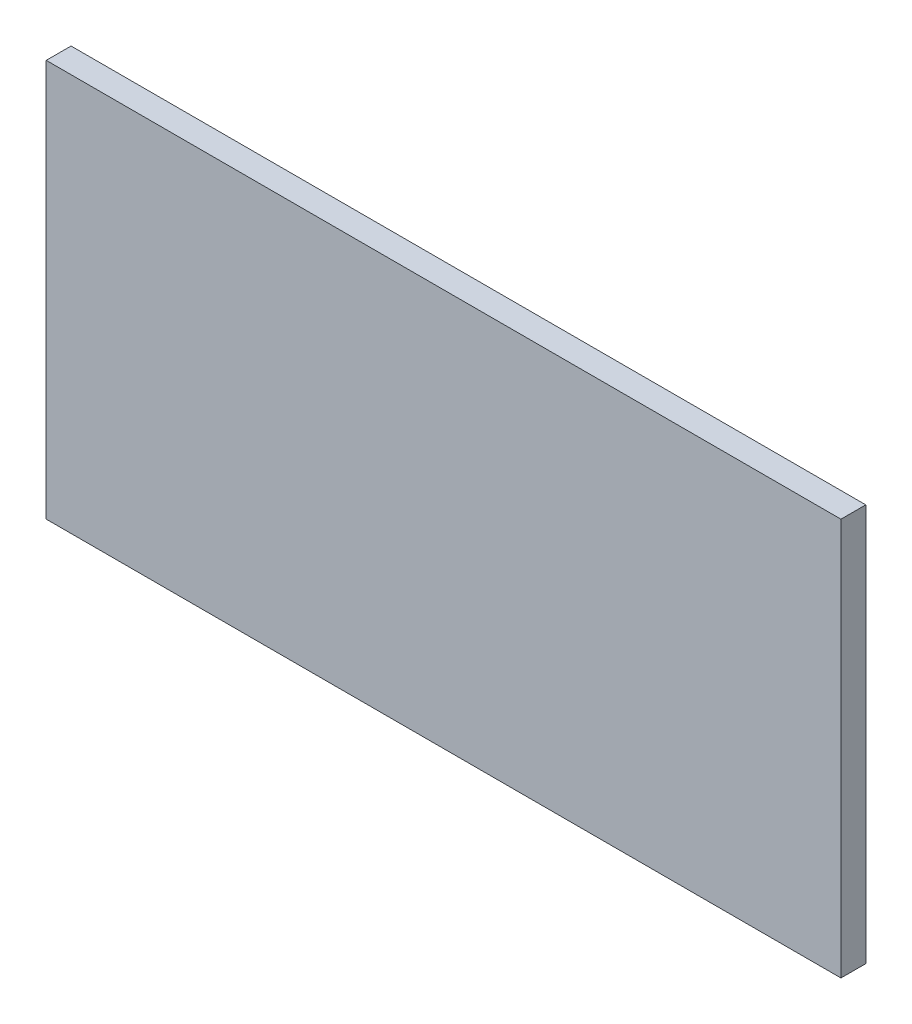
ISO-10303-21;
HEADER;
FILE_DESCRIPTION(('STEP AP214'),'2;1');
FILE_NAME('part.step','',(''),(''),'','','');
FILE_SCHEMA(('AUTOMOTIVE_DESIGN { 1 0 10303 214 1 1 1 1 }'));
ENDSEC;
DATA;
#1=APPLICATION_CONTEXT('core data for automotive mechanical design processes');
#2=APPLICATION_PROTOCOL_DEFINITION('international standard','automotive_design',2000,#1);
#3=PRODUCT_CONTEXT('',#1,'mechanical');
#4=PRODUCT('Part','Part','',(#3));
#5=PRODUCT_RELATED_PRODUCT_CATEGORY('part','',(#4));
#6=PRODUCT_DEFINITION_FORMATION('','',#4);
#7=PRODUCT_DEFINITION_CONTEXT('part definition',#1,'design');
#8=PRODUCT_DEFINITION('design','',#6,#7);
#9=PRODUCT_DEFINITION_SHAPE('','',#8);
#10=(LENGTH_UNIT() NAMED_UNIT(*) SI_UNIT(.MILLI.,.METRE.));
#11=(NAMED_UNIT(*) PLANE_ANGLE_UNIT() SI_UNIT($,.RADIAN.));
#12=(NAMED_UNIT(*) SI_UNIT($,.STERADIAN.) SOLID_ANGLE_UNIT());
#13=UNCERTAINTY_MEASURE_WITH_UNIT(LENGTH_MEASURE(1.E-05),#10,'distance_accuracy_value','');
#14=(GEOMETRIC_REPRESENTATION_CONTEXT(3) GLOBAL_UNCERTAINTY_ASSIGNED_CONTEXT((#13)) GLOBAL_UNIT_ASSIGNED_CONTEXT((#10,
#11,#12)) REPRESENTATION_CONTEXT('',''));
#15=CARTESIAN_POINT('',(0.,0.,0.));
#16=DIRECTION('',(0.,0.,1.));
#17=DIRECTION('',(1.,0.,0.));
#18=AXIS2_PLACEMENT_3D('',#15,#16,#17);
#19=CARTESIAN_POINT('',(40.,20.,2.5));
#20=DIRECTION('',(-1.,0.,0.));
#21=DIRECTION('',(0.,-1.,0.));
#22=AXIS2_PLACEMENT_3D('',#19,#20,#21);
#23=PLANE('',#22);
#24=DIRECTION('',(0.,1.,0.));
#25=VECTOR('',#24,1.);
#26=CARTESIAN_POINT('',(40.,20.,0.));
#27=LINE('',#26,#25);
#28=CARTESIAN_POINT('',(40.,-20.,0.));
#29=VERTEX_POINT('',#28);
#30=CARTESIAN_POINT('',(40.,20.,0.));
#31=VERTEX_POINT('',#30);
#32=EDGE_CURVE('E107',#29,#31,#27,.T.);
#33=ORIENTED_EDGE('',*,*,#32,.T.);
#34=DIRECTION('',(0.,0.,-1.));
#35=VECTOR('',#34,1.);
#36=CARTESIAN_POINT('',(40.,20.,2.5));
#37=LINE('',#36,#35);
#38=CARTESIAN_POINT('',(40.,20.,2.5));
#39=VERTEX_POINT('',#38);
#40=EDGE_CURVE('E11',#39,#31,#37,.T.);
#41=ORIENTED_EDGE('',*,*,#40,.F.);
#42=DIRECTION('',(0.,1.,0.));
#43=VECTOR('',#42,1.);
#44=CARTESIAN_POINT('',(40.,20.,2.5));
#45=LINE('',#44,#43);
#46=CARTESIAN_POINT('',(40.,-20.,2.5));
#47=VERTEX_POINT('',#46);
#48=EDGE_CURVE('E91',#47,#39,#45,.T.);
#49=ORIENTED_EDGE('',*,*,#48,.F.);
#50=DIRECTION('',(0.,0.,-1.));
#51=VECTOR('',#50,1.);
#52=CARTESIAN_POINT('',(40.,-20.,2.5));
#53=LINE('',#52,#51);
#54=EDGE_CURVE('E103',#47,#29,#53,.T.);
#55=ORIENTED_EDGE('',*,*,#54,.T.);
#56=EDGE_LOOP('',(#33,#41,#49,#55));
#57=FACE_BOUND('',#56,.T.);
#58=ADVANCED_FACE('F39',(#57),#23,.F.);
#59=CARTESIAN_POINT('',(-40.,20.,2.5));
#60=DIRECTION('',(0.,-1.,0.));
#61=DIRECTION('',(0.,0.,-1.));
#62=AXIS2_PLACEMENT_3D('',#59,#60,#61);
#63=PLANE('',#62);
#64=DIRECTION('',(-1.,0.,0.));
#65=VECTOR('',#64,1.);
#66=CARTESIAN_POINT('',(-40.,20.,0.));
#67=LINE('',#66,#65);
#68=CARTESIAN_POINT('',(-40.,20.,0.));
#69=VERTEX_POINT('',#68);
#70=EDGE_CURVE('E96',#31,#69,#67,.T.);
#71=ORIENTED_EDGE('',*,*,#70,.T.);
#72=DIRECTION('',(0.,0.,-1.));
#73=VECTOR('',#72,1.);
#74=CARTESIAN_POINT('',(-40.,20.,2.5));
#75=LINE('',#74,#73);
#76=CARTESIAN_POINT('',(-40.,20.,2.5));
#77=VERTEX_POINT('',#76);
#78=EDGE_CURVE('E48',#77,#69,#75,.T.);
#79=ORIENTED_EDGE('',*,*,#78,.F.);
#80=DIRECTION('',(-1.,0.,0.));
#81=VECTOR('',#80,1.);
#82=CARTESIAN_POINT('',(-40.,20.,2.5));
#83=LINE('',#82,#81);
#84=EDGE_CURVE('E86',#39,#77,#83,.T.);
#85=ORIENTED_EDGE('',*,*,#84,.F.);
#86=ORIENTED_EDGE('',*,*,#40,.T.);
#87=EDGE_LOOP('',(#71,#79,#85,#86));
#88=FACE_BOUND('',#87,.T.);
#89=ADVANCED_FACE('F95',(#88),#63,.F.);
#90=CARTESIAN_POINT('',(-40.,20.,2.5));
#91=DIRECTION('',(1.,0.,0.));
#92=DIRECTION('',(0.,1.,0.));
#93=AXIS2_PLACEMENT_3D('',#90,#91,#92);
#94=PLANE('',#93);
#95=DIRECTION('',(0.,-1.,0.));
#96=VECTOR('',#95,1.);
#97=CARTESIAN_POINT('',(-40.,20.,0.));
#98=LINE('',#97,#96);
#99=CARTESIAN_POINT('',(-40.,-20.,0.));
#100=VERTEX_POINT('',#99);
#101=EDGE_CURVE('E73',#69,#100,#98,.T.);
#102=ORIENTED_EDGE('',*,*,#101,.T.);
#103=DIRECTION('',(0.,0.,-1.));
#104=VECTOR('',#103,1.);
#105=CARTESIAN_POINT('',(-40.,-20.,2.5));
#106=LINE('',#105,#104);
#107=CARTESIAN_POINT('',(-40.,-20.,2.5));
#108=VERTEX_POINT('',#107);
#109=EDGE_CURVE('E98',#108,#100,#106,.T.);
#110=ORIENTED_EDGE('',*,*,#109,.F.);
#111=DIRECTION('',(0.,-1.,0.));
#112=VECTOR('',#111,1.);
#113=CARTESIAN_POINT('',(-40.,20.,2.5));
#114=LINE('',#113,#112);
#115=EDGE_CURVE('E89',#77,#108,#114,.T.);
#116=ORIENTED_EDGE('',*,*,#115,.F.);
#117=ORIENTED_EDGE('',*,*,#78,.T.);
#118=EDGE_LOOP('',(#102,#110,#116,#117));
#119=FACE_BOUND('',#118,.T.);
#120=ADVANCED_FACE('F99',(#119),#94,.F.);
#121=CARTESIAN_POINT('',(-40.,-20.,2.5));
#122=DIRECTION('',(0.,1.,0.));
#123=DIRECTION('',(0.,0.,1.));
#124=AXIS2_PLACEMENT_3D('',#121,#122,#123);
#125=PLANE('',#124);
#126=DIRECTION('',(1.,0.,0.));
#127=VECTOR('',#126,1.);
#128=CARTESIAN_POINT('',(-40.,-20.,0.));
#129=LINE('',#128,#127);
#130=EDGE_CURVE('E79',#100,#29,#129,.T.);
#131=ORIENTED_EDGE('',*,*,#130,.T.);
#132=ORIENTED_EDGE('',*,*,#54,.F.);
#133=DIRECTION('',(1.,0.,0.));
#134=VECTOR('',#133,1.);
#135=CARTESIAN_POINT('',(-40.,-20.,2.5));
#136=LINE('',#135,#134);
#137=EDGE_CURVE('E56',#108,#47,#136,.T.);
#138=ORIENTED_EDGE('',*,*,#137,.F.);
#139=ORIENTED_EDGE('',*,*,#109,.T.);
#140=EDGE_LOOP('',(#131,#132,#138,#139));
#141=FACE_BOUND('',#140,.T.);
#142=ADVANCED_FACE('F120',(#141),#125,.F.);
#143=CARTESIAN_POINT('',(0.,0.,2.5));
#144=DIRECTION('',(0.,0.,1.));
#145=DIRECTION('',(1.,0.,0.));
#146=AXIS2_PLACEMENT_3D('',#143,#144,#145);
#147=PLANE('',#146);
#148=ORIENTED_EDGE('',*,*,#48,.T.);
#149=ORIENTED_EDGE('',*,*,#84,.T.);
#150=ORIENTED_EDGE('',*,*,#115,.T.);
#151=ORIENTED_EDGE('',*,*,#137,.T.);
#152=EDGE_LOOP('',(#148,#149,#150,#151));
#153=FACE_BOUND('',#152,.T.);
#154=ADVANCED_FACE('F87',(#153),#147,.T.);
#155=CARTESIAN_POINT('',(0.,0.,0.));
#156=DIRECTION('',(0.,0.,1.));
#157=DIRECTION('',(1.,0.,0.));
#158=AXIS2_PLACEMENT_3D('',#155,#156,#157);
#159=PLANE('',#158);
#160=ORIENTED_EDGE('',*,*,#32,.F.);
#161=ORIENTED_EDGE('',*,*,#130,.F.);
#162=ORIENTED_EDGE('',*,*,#101,.F.);
#163=ORIENTED_EDGE('',*,*,#70,.F.);
#164=EDGE_LOOP('',(#160,#161,#162,#163));
#165=FACE_BOUND('',#164,.T.);
#166=ADVANCED_FACE('F123',(#165),#159,.F.);
#167=CLOSED_SHELL('',(#58,#89,#120,#142,#154,#166));
#168=MANIFOLD_SOLID_BREP('B2',#167);
#169=ADVANCED_BREP_SHAPE_REPRESENTATION('',(#18,#168),#14);
#170=SHAPE_DEFINITION_REPRESENTATION(#9,#169);
ENDSEC;
END-ISO-10303-21;
